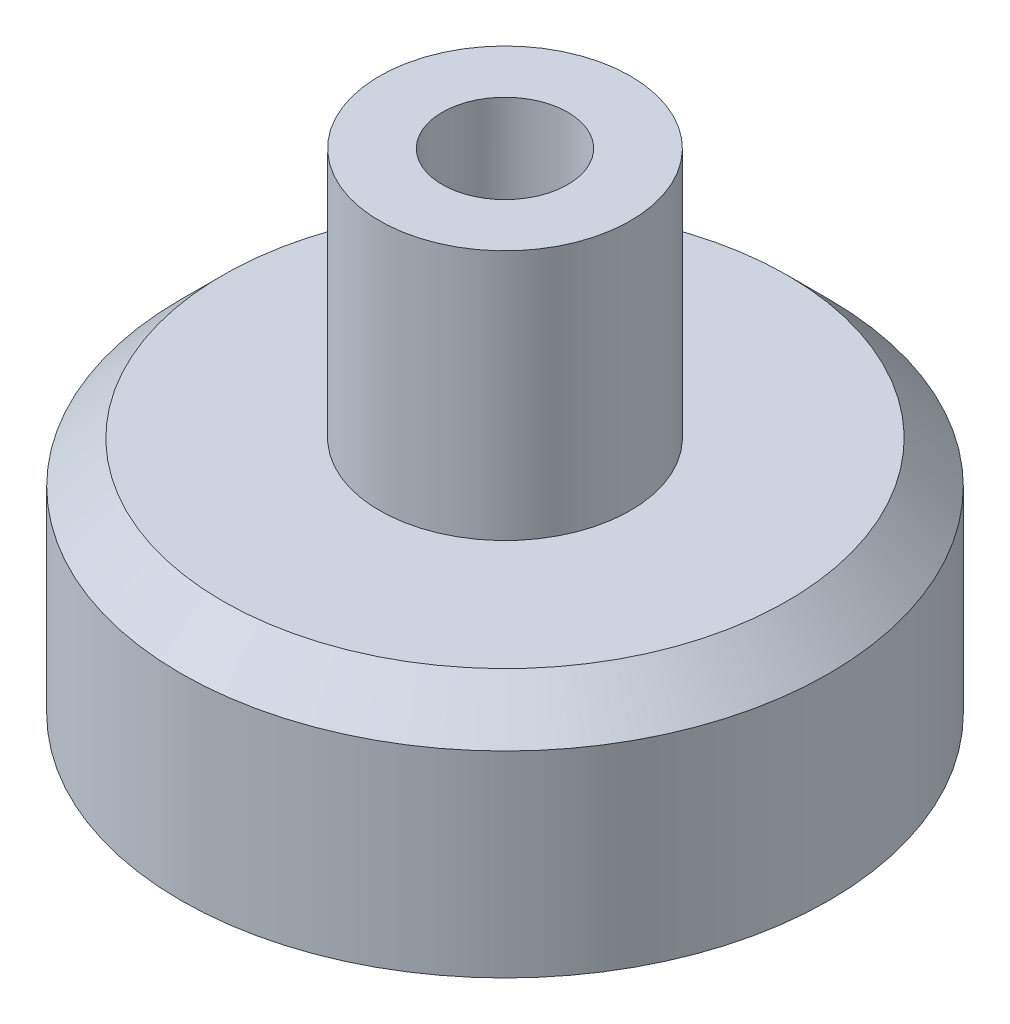
ISO-10303-21;
HEADER;
FILE_DESCRIPTION(('STEP AP214'),'2;1');
FILE_NAME('part.step','',(''),(''),'','','');
FILE_SCHEMA(('AUTOMOTIVE_DESIGN { 1 0 10303 214 1 1 1 1 }'));
ENDSEC;
DATA;
#1=APPLICATION_CONTEXT('core data for automotive mechanical design processes');
#2=APPLICATION_PROTOCOL_DEFINITION('international standard','automotive_design',2000,#1);
#3=PRODUCT_CONTEXT('',#1,'mechanical');
#4=PRODUCT('Part','Part','',(#3));
#5=PRODUCT_RELATED_PRODUCT_CATEGORY('part','',(#4));
#6=PRODUCT_DEFINITION_FORMATION('','',#4);
#7=PRODUCT_DEFINITION_CONTEXT('part definition',#1,'design');
#8=PRODUCT_DEFINITION('design','',#6,#7);
#9=PRODUCT_DEFINITION_SHAPE('','',#8);
#10=(LENGTH_UNIT() NAMED_UNIT(*) SI_UNIT(.MILLI.,.METRE.));
#11=(NAMED_UNIT(*) PLANE_ANGLE_UNIT() SI_UNIT($,.RADIAN.));
#12=(NAMED_UNIT(*) SI_UNIT($,.STERADIAN.) SOLID_ANGLE_UNIT());
#13=UNCERTAINTY_MEASURE_WITH_UNIT(LENGTH_MEASURE(1.E-05),#10,'distance_accuracy_value','');
#14=(GEOMETRIC_REPRESENTATION_CONTEXT(3) GLOBAL_UNCERTAINTY_ASSIGNED_CONTEXT((#13)) GLOBAL_UNIT_ASSIGNED_CONTEXT((#10,
#11,#12)) REPRESENTATION_CONTEXT('',''));
#15=CARTESIAN_POINT('',(0.,0.,0.));
#16=DIRECTION('',(0.,0.,1.));
#17=DIRECTION('',(1.,0.,0.));
#18=AXIS2_PLACEMENT_3D('',#15,#16,#17);
#19=CARTESIAN_POINT('',(-13.5,0.,0.));
#20=DIRECTION('',(0.,1.,0.));
#21=DIRECTION('',(0.,0.,1.));
#22=AXIS2_PLACEMENT_3D('',#19,#20,#21);
#23=PLANE('',#22);
#24=CARTESIAN_POINT('',(0.,0.,0.));
#25=DIRECTION('',(0.,-1.,0.));
#26=DIRECTION('',(0.,0.,-1.));
#27=AXIS2_PLACEMENT_3D('',#24,#25,#26);
#28=CIRCLE('',#27,13.5);
#29=CARTESIAN_POINT('',(0.,0.,-13.5));
#30=VERTEX_POINT('',#29);
#31=EDGE_CURVE('E69',#30,#30,#28,.T.);
#32=ORIENTED_EDGE('',*,*,#31,.F.);
#33=EDGE_LOOP('',(#32));
#34=FACE_BOUND('',#33,.T.);
#35=CARTESIAN_POINT('',(0.,0.,0.));
#36=DIRECTION('',(0.,-1.,0.));
#37=DIRECTION('',(0.,0.,-1.));
#38=AXIS2_PLACEMENT_3D('',#35,#36,#37);
#39=CIRCLE('',#38,15.5);
#40=CARTESIAN_POINT('',(0.,0.,-15.5));
#41=VERTEX_POINT('',#40);
#42=EDGE_CURVE('E57',#41,#41,#39,.T.);
#43=ORIENTED_EDGE('',*,*,#42,.T.);
#44=EDGE_LOOP('',(#43));
#45=FACE_BOUND('',#44,.T.);
#46=ADVANCED_FACE('F31',(#34,#45),#23,.F.);
#47=CARTESIAN_POINT('',(0.,0.,0.));
#48=DIRECTION('',(0.,-1.,0.));
#49=DIRECTION('',(0.,0.,-1.));
#50=AXIS2_PLACEMENT_3D('',#47,#48,#49);
#51=CYLINDRICAL_SURFACE('',#50,15.5);
#52=CARTESIAN_POINT('',(0.,9.4,0.));
#53=DIRECTION('',(0.,-1.,0.));
#54=DIRECTION('',(0.,0.,-1.));
#55=AXIS2_PLACEMENT_3D('',#52,#53,#54);
#56=CIRCLE('',#55,15.5);
#57=CARTESIAN_POINT('',(0.,9.4,-15.5));
#58=VERTEX_POINT('',#57);
#59=EDGE_CURVE('E46',#58,#58,#56,.T.);
#60=ORIENTED_EDGE('',*,*,#59,.T.);
#61=EDGE_LOOP('',(#60));
#62=FACE_BOUND('',#61,.T.);
#63=ORIENTED_EDGE('',*,*,#42,.F.);
#64=EDGE_LOOP('',(#63));
#65=FACE_BOUND('',#64,.T.);
#66=ADVANCED_FACE('F77',(#62,#65),#51,.T.);
#67=CARTESIAN_POINT('',(-15.5,11.4,0.));
#68=DIRECTION('',(0.,-1.,0.));
#69=DIRECTION('',(0.,0.,-1.));
#70=AXIS2_PLACEMENT_3D('',#67,#68,#69);
#71=PLANE('',#70);
#72=CARTESIAN_POINT('',(0.,11.4,0.));
#73=DIRECTION('',(0.,-1.,0.));
#74=DIRECTION('',(0.,0.,-1.));
#75=AXIS2_PLACEMENT_3D('',#72,#73,#74);
#76=CIRCLE('',#75,13.5);
#77=CARTESIAN_POINT('',(0.,11.4,-13.5));
#78=VERTEX_POINT('',#77);
#79=EDGE_CURVE('E42',#78,#78,#76,.F.);
#80=ORIENTED_EDGE('',*,*,#79,.T.);
#81=EDGE_LOOP('',(#80));
#82=FACE_BOUND('',#81,.T.);
#83=CARTESIAN_POINT('',(0.,11.4,0.));
#84=DIRECTION('',(0.,-1.,0.));
#85=DIRECTION('',(0.,0.,-1.));
#86=AXIS2_PLACEMENT_3D('',#83,#84,#85);
#87=CIRCLE('',#86,6.);
#88=CARTESIAN_POINT('',(0.,11.4,-6.));
#89=VERTEX_POINT('',#88);
#90=EDGE_CURVE('E60',#89,#89,#87,.T.);
#91=ORIENTED_EDGE('',*,*,#90,.T.);
#92=EDGE_LOOP('',(#91));
#93=FACE_BOUND('',#92,.T.);
#94=ADVANCED_FACE('F82',(#82,#93),#71,.F.);
#95=CARTESIAN_POINT('',(0.,0.,0.));
#96=DIRECTION('',(0.,-1.,0.));
#97=DIRECTION('',(0.,0.,-1.));
#98=AXIS2_PLACEMENT_3D('',#95,#96,#97);
#99=CYLINDRICAL_SURFACE('',#98,6.);
#100=ORIENTED_EDGE('',*,*,#90,.F.);
#101=EDGE_LOOP('',(#100));
#102=FACE_BOUND('',#101,.T.);
#103=CARTESIAN_POINT('',(0.,23.4,0.));
#104=DIRECTION('',(0.,-1.,0.));
#105=DIRECTION('',(0.,0.,-1.));
#106=AXIS2_PLACEMENT_3D('',#103,#104,#105);
#107=CIRCLE('',#106,6.);
#108=CARTESIAN_POINT('',(0.,23.4,-6.));
#109=VERTEX_POINT('',#108);
#110=EDGE_CURVE('E63',#109,#109,#107,.T.);
#111=ORIENTED_EDGE('',*,*,#110,.T.);
#112=EDGE_LOOP('',(#111));
#113=FACE_BOUND('',#112,.T.);
#114=ADVANCED_FACE('F88',(#102,#113),#99,.T.);
#115=CARTESIAN_POINT('',(-6.,23.4,0.));
#116=DIRECTION('',(0.,-1.,0.));
#117=DIRECTION('',(0.,0.,-1.));
#118=AXIS2_PLACEMENT_3D('',#115,#116,#117);
#119=PLANE('',#118);
#120=ORIENTED_EDGE('',*,*,#110,.F.);
#121=EDGE_LOOP('',(#120));
#122=FACE_BOUND('',#121,.T.);
#123=CARTESIAN_POINT('',(0.,23.4,0.));
#124=DIRECTION('',(0.,-1.,0.));
#125=DIRECTION('',(0.,0.,-1.));
#126=AXIS2_PLACEMENT_3D('',#123,#124,#125);
#127=CIRCLE('',#126,3.);
#128=CARTESIAN_POINT('',(0.,23.4,-3.));
#129=VERTEX_POINT('',#128);
#130=EDGE_CURVE('E66',#129,#129,#127,.T.);
#131=ORIENTED_EDGE('',*,*,#130,.T.);
#132=EDGE_LOOP('',(#131));
#133=FACE_BOUND('',#132,.T.);
#134=ADVANCED_FACE('F111',(#122,#133),#119,.F.);
#135=CARTESIAN_POINT('',(0.,0.,0.));
#136=DIRECTION('',(0.,-1.,0.));
#137=DIRECTION('',(0.,0.,-1.));
#138=AXIS2_PLACEMENT_3D('',#135,#136,#137);
#139=CYLINDRICAL_SURFACE('',#138,3.);
#140=CARTESIAN_POINT('',(0.,11.4,0.));
#141=DIRECTION('',(0.,1.,0.));
#142=DIRECTION('',(0.,0.,1.));
#143=AXIS2_PLACEMENT_3D('',#140,#141,#142);
#144=CIRCLE('',#143,3.);
#145=CARTESIAN_POINT('',(0.,11.4,3.));
#146=VERTEX_POINT('',#145);
#147=EDGE_CURVE('E38',#146,#146,#144,.F.);
#148=ORIENTED_EDGE('',*,*,#147,.T.);
#149=EDGE_LOOP('',(#148));
#150=FACE_BOUND('',#149,.T.);
#151=ORIENTED_EDGE('',*,*,#130,.F.);
#152=EDGE_LOOP('',(#151));
#153=FACE_BOUND('',#152,.T.);
#154=ADVANCED_FACE('F116',(#150,#153),#139,.F.);
#155=CARTESIAN_POINT('',(-3.,9.4,0.));
#156=DIRECTION('',(0.,1.,0.));
#157=DIRECTION('',(0.,0.,1.));
#158=AXIS2_PLACEMENT_3D('',#155,#156,#157);
#159=PLANE('',#158);
#160=CARTESIAN_POINT('',(0.,9.4,0.));
#161=DIRECTION('',(0.,1.,0.));
#162=DIRECTION('',(0.,0.,1.));
#163=AXIS2_PLACEMENT_3D('',#160,#161,#162);
#164=CIRCLE('',#163,5.);
#165=CARTESIAN_POINT('',(0.,9.4,5.));
#166=VERTEX_POINT('',#165);
#167=EDGE_CURVE('E10',#166,#166,#164,.T.);
#168=ORIENTED_EDGE('',*,*,#167,.T.);
#169=EDGE_LOOP('',(#168));
#170=FACE_BOUND('',#169,.T.);
#171=CARTESIAN_POINT('',(0.,9.4,0.));
#172=DIRECTION('',(0.,1.,0.));
#173=DIRECTION('',(0.,0.,1.));
#174=AXIS2_PLACEMENT_3D('',#171,#172,#173);
#175=CIRCLE('',#174,11.5);
#176=CARTESIAN_POINT('',(0.,9.4,11.5));
#177=VERTEX_POINT('',#176);
#178=EDGE_CURVE('E54',#177,#177,#175,.F.);
#179=ORIENTED_EDGE('',*,*,#178,.T.);
#180=EDGE_LOOP('',(#179));
#181=FACE_BOUND('',#180,.T.);
#182=ADVANCED_FACE('F121',(#170,#181),#159,.F.);
#183=CARTESIAN_POINT('',(0.,0.,0.));
#184=DIRECTION('',(0.,-1.,0.));
#185=DIRECTION('',(0.,0.,-1.));
#186=AXIS2_PLACEMENT_3D('',#183,#184,#185);
#187=CYLINDRICAL_SURFACE('',#186,13.5);
#188=CARTESIAN_POINT('',(0.,7.40000000000001,0.));
#189=DIRECTION('',(0.,1.,0.));
#190=DIRECTION('',(0.,0.,1.));
#191=AXIS2_PLACEMENT_3D('',#188,#189,#190);
#192=CIRCLE('',#191,13.5);
#193=CARTESIAN_POINT('',(0.,7.40000000000001,13.5));
#194=VERTEX_POINT('',#193);
#195=EDGE_CURVE('E51',#194,#194,#192,.T.);
#196=ORIENTED_EDGE('',*,*,#195,.T.);
#197=EDGE_LOOP('',(#196));
#198=FACE_BOUND('',#197,.T.);
#199=ORIENTED_EDGE('',*,*,#31,.T.);
#200=EDGE_LOOP('',(#199));
#201=FACE_BOUND('',#200,.T.);
#202=ADVANCED_FACE('F73',(#198,#201),#187,.F.);
#203=CARTESIAN_POINT('',(0.,9.4,0.));
#204=DIRECTION('',(0.,-1.,0.));
#205=DIRECTION('',(0.,0.,-1.));
#206=AXIS2_PLACEMENT_3D('',#203,#204,#205);
#207=CONICAL_SURFACE('',#206,11.5,0.785398163397452);
#208=ORIENTED_EDGE('',*,*,#195,.F.);
#209=EDGE_LOOP('',(#208));
#210=FACE_BOUND('',#209,.T.);
#211=ORIENTED_EDGE('',*,*,#178,.F.);
#212=EDGE_LOOP('',(#211));
#213=FACE_BOUND('',#212,.T.);
#214=ADVANCED_FACE('F93',(#210,#213),#207,.F.);
#215=CARTESIAN_POINT('',(0.,9.4,0.));
#216=DIRECTION('',(0.,-1.,0.));
#217=DIRECTION('',(0.,0.,-1.));
#218=AXIS2_PLACEMENT_3D('',#215,#216,#217);
#219=CONICAL_SURFACE('',#218,15.5,0.785398163397449);
#220=ORIENTED_EDGE('',*,*,#79,.F.);
#221=EDGE_LOOP('',(#220));
#222=FACE_BOUND('',#221,.T.);
#223=ORIENTED_EDGE('',*,*,#59,.F.);
#224=EDGE_LOOP('',(#223));
#225=FACE_BOUND('',#224,.T.);
#226=ADVANCED_FACE('F95',(#222,#225),#219,.T.);
#227=CARTESIAN_POINT('',(0.,11.4,0.));
#228=DIRECTION('',(0.,-1.,0.));
#229=DIRECTION('',(0.,0.,-1.));
#230=AXIS2_PLACEMENT_3D('',#227,#228,#229);
#231=CONICAL_SURFACE('',#230,3.,0.785398163397449);
#232=ORIENTED_EDGE('',*,*,#167,.F.);
#233=EDGE_LOOP('',(#232));
#234=FACE_BOUND('',#233,.T.);
#235=ORIENTED_EDGE('',*,*,#147,.F.);
#236=EDGE_LOOP('',(#235));
#237=FACE_BOUND('',#236,.T.);
#238=ADVANCED_FACE('F33',(#234,#237),#231,.F.);
#239=CLOSED_SHELL('',(#46,#66,#94,#114,#134,#154,#182,#202,#214,#226,#238));
#240=MANIFOLD_SOLID_BREP('B2',#239);
#241=ADVANCED_BREP_SHAPE_REPRESENTATION('',(#18,#240),#14);
#242=SHAPE_DEFINITION_REPRESENTATION(#9,#241);
ENDSEC;
END-ISO-10303-21;
